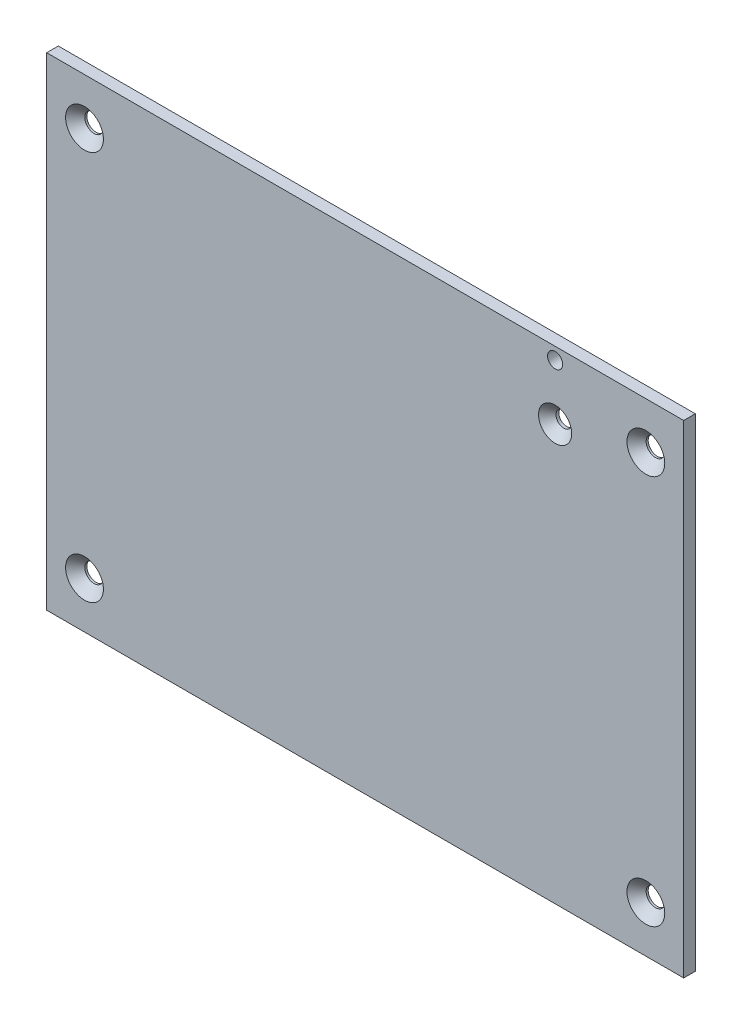
ISO-10303-21;
HEADER;
FILE_DESCRIPTION(('STEP AP214'),'2;1');
FILE_NAME('part.step','',(''),(''),'','','');
FILE_SCHEMA(('AUTOMOTIVE_DESIGN { 1 0 10303 214 1 1 1 1 }'));
ENDSEC;
DATA;
#1=APPLICATION_CONTEXT('core data for automotive mechanical design processes');
#2=APPLICATION_PROTOCOL_DEFINITION('international standard','automotive_design',2000,#1);
#3=PRODUCT_CONTEXT('',#1,'mechanical');
#4=PRODUCT('Part','Part','',(#3));
#5=PRODUCT_RELATED_PRODUCT_CATEGORY('part','',(#4));
#6=PRODUCT_DEFINITION_FORMATION('','',#4);
#7=PRODUCT_DEFINITION_CONTEXT('part definition',#1,'design');
#8=PRODUCT_DEFINITION('design','',#6,#7);
#9=PRODUCT_DEFINITION_SHAPE('','',#8);
#10=(LENGTH_UNIT() NAMED_UNIT(*) SI_UNIT(.MILLI.,.METRE.));
#11=(NAMED_UNIT(*) PLANE_ANGLE_UNIT() SI_UNIT($,.RADIAN.));
#12=(NAMED_UNIT(*) SI_UNIT($,.STERADIAN.) SOLID_ANGLE_UNIT());
#13=UNCERTAINTY_MEASURE_WITH_UNIT(LENGTH_MEASURE(1.E-05),#10,'distance_accuracy_value','');
#14=(GEOMETRIC_REPRESENTATION_CONTEXT(3) GLOBAL_UNCERTAINTY_ASSIGNED_CONTEXT((#13)) GLOBAL_UNIT_ASSIGNED_CONTEXT((#10,
#11,#12)) REPRESENTATION_CONTEXT('',''));
#15=CARTESIAN_POINT('',(0.,0.,0.));
#16=DIRECTION('',(0.,0.,1.));
#17=DIRECTION('',(1.,0.,0.));
#18=AXIS2_PLACEMENT_3D('',#15,#16,#17);
#19=CARTESIAN_POINT('',(-54.75,0.,2.));
#20=DIRECTION('',(1.,0.,0.));
#21=DIRECTION('',(0.,0.,-1.));
#22=AXIS2_PLACEMENT_3D('',#19,#20,#21);
#23=PLANE('',#22);
#24=DIRECTION('',(0.,-1.,0.));
#25=VECTOR('',#24,1.);
#26=CARTESIAN_POINT('',(-54.75,0.,0.));
#27=LINE('',#26,#25);
#28=CARTESIAN_POINT('',(-54.75,0.,0.));
#29=VERTEX_POINT('',#28);
#30=CARTESIAN_POINT('',(-54.75,-83.,0.));
#31=VERTEX_POINT('',#30);
#32=EDGE_CURVE('E96',#29,#31,#27,.T.);
#33=ORIENTED_EDGE('',*,*,#32,.T.);
#34=DIRECTION('',(0.,0.,-1.));
#35=VECTOR('',#34,1.);
#36=CARTESIAN_POINT('',(-54.75,-83.,2.));
#37=LINE('',#36,#35);
#38=CARTESIAN_POINT('',(-54.75,-83.,2.));
#39=VERTEX_POINT('',#38);
#40=EDGE_CURVE('E11',#39,#31,#37,.T.);
#41=ORIENTED_EDGE('',*,*,#40,.F.);
#42=DIRECTION('',(0.,-1.,0.));
#43=VECTOR('',#42,1.);
#44=CARTESIAN_POINT('',(-54.75,0.,2.));
#45=LINE('',#44,#43);
#46=CARTESIAN_POINT('',(-54.75,0.,2.));
#47=VERTEX_POINT('',#46);
#48=EDGE_CURVE('E84',#47,#39,#45,.T.);
#49=ORIENTED_EDGE('',*,*,#48,.F.);
#50=DIRECTION('',(0.,0.,-1.));
#51=VECTOR('',#50,1.);
#52=CARTESIAN_POINT('',(-54.75,0.,2.));
#53=LINE('',#52,#51);
#54=EDGE_CURVE('E92',#47,#29,#53,.T.);
#55=ORIENTED_EDGE('',*,*,#54,.T.);
#56=EDGE_LOOP('',(#33,#41,#49,#55));
#57=FACE_BOUND('',#56,.T.);
#58=ADVANCED_FACE('F33',(#57),#23,.F.);
#59=CARTESIAN_POINT('',(-54.75,-83.,2.));
#60=DIRECTION('',(0.,1.,0.));
#61=DIRECTION('',(0.,0.,1.));
#62=AXIS2_PLACEMENT_3D('',#59,#60,#61);
#63=PLANE('',#62);
#64=DIRECTION('',(1.,0.,0.));
#65=VECTOR('',#64,1.);
#66=CARTESIAN_POINT('',(-54.75,-83.,0.));
#67=LINE('',#66,#65);
#68=CARTESIAN_POINT('',(54.75,-83.,0.));
#69=VERTEX_POINT('',#68);
#70=EDGE_CURVE('E88',#31,#69,#67,.T.);
#71=ORIENTED_EDGE('',*,*,#70,.T.);
#72=DIRECTION('',(0.,0.,-1.));
#73=VECTOR('',#72,1.);
#74=CARTESIAN_POINT('',(54.75,-83.,2.));
#75=LINE('',#74,#73);
#76=CARTESIAN_POINT('',(54.75,-83.,2.));
#77=VERTEX_POINT('',#76);
#78=EDGE_CURVE('E41',#77,#69,#75,.T.);
#79=ORIENTED_EDGE('',*,*,#78,.F.);
#80=DIRECTION('',(1.,0.,0.));
#81=VECTOR('',#80,1.);
#82=CARTESIAN_POINT('',(-54.75,-83.,2.));
#83=LINE('',#82,#81);
#84=EDGE_CURVE('E79',#39,#77,#83,.T.);
#85=ORIENTED_EDGE('',*,*,#84,.F.);
#86=ORIENTED_EDGE('',*,*,#40,.T.);
#87=EDGE_LOOP('',(#71,#79,#85,#86));
#88=FACE_BOUND('',#87,.T.);
#89=ADVANCED_FACE('F87',(#88),#63,.F.);
#90=CARTESIAN_POINT('',(54.75,0.,2.));
#91=DIRECTION('',(-1.,0.,0.));
#92=DIRECTION('',(0.,-1.,0.));
#93=AXIS2_PLACEMENT_3D('',#90,#91,#92);
#94=PLANE('',#93);
#95=DIRECTION('',(0.,1.,0.));
#96=VECTOR('',#95,1.);
#97=CARTESIAN_POINT('',(54.75,0.,0.));
#98=LINE('',#97,#96);
#99=CARTESIAN_POINT('',(54.75,0.,0.));
#100=VERTEX_POINT('',#99);
#101=EDGE_CURVE('E66',#69,#100,#98,.T.);
#102=ORIENTED_EDGE('',*,*,#101,.T.);
#103=DIRECTION('',(0.,0.,-1.));
#104=VECTOR('',#103,1.);
#105=CARTESIAN_POINT('',(54.75,0.,2.));
#106=LINE('',#105,#104);
#107=CARTESIAN_POINT('',(54.75,0.,2.));
#108=VERTEX_POINT('',#107);
#109=EDGE_CURVE('E89',#108,#100,#106,.T.);
#110=ORIENTED_EDGE('',*,*,#109,.F.);
#111=DIRECTION('',(0.,1.,0.));
#112=VECTOR('',#111,1.);
#113=CARTESIAN_POINT('',(54.75,0.,2.));
#114=LINE('',#113,#112);
#115=EDGE_CURVE('E82',#77,#108,#114,.T.);
#116=ORIENTED_EDGE('',*,*,#115,.F.);
#117=ORIENTED_EDGE('',*,*,#78,.T.);
#118=EDGE_LOOP('',(#102,#110,#116,#117));
#119=FACE_BOUND('',#118,.T.);
#120=ADVANCED_FACE('F90',(#119),#94,.F.);
#121=CARTESIAN_POINT('',(-54.75,0.,2.));
#122=DIRECTION('',(0.,-1.,0.));
#123=DIRECTION('',(0.,0.,-1.));
#124=AXIS2_PLACEMENT_3D('',#121,#122,#123);
#125=PLANE('',#124);
#126=DIRECTION('',(-1.,0.,0.));
#127=VECTOR('',#126,1.);
#128=CARTESIAN_POINT('',(-54.75,0.,0.));
#129=LINE('',#128,#127);
#130=EDGE_CURVE('E72',#100,#29,#129,.T.);
#131=ORIENTED_EDGE('',*,*,#130,.T.);
#132=ORIENTED_EDGE('',*,*,#54,.F.);
#133=DIRECTION('',(-1.,0.,0.));
#134=VECTOR('',#133,1.);
#135=CARTESIAN_POINT('',(-54.75,0.,2.));
#136=LINE('',#135,#134);
#137=EDGE_CURVE('E49',#108,#47,#136,.T.);
#138=ORIENTED_EDGE('',*,*,#137,.F.);
#139=ORIENTED_EDGE('',*,*,#109,.T.);
#140=EDGE_LOOP('',(#131,#132,#138,#139));
#141=FACE_BOUND('',#140,.T.);
#142=ADVANCED_FACE('F104',(#141),#125,.F.);
#143=CARTESIAN_POINT('',(-54.75,-83.,2.));
#144=DIRECTION('',(0.,0.,1.));
#145=DIRECTION('',(1.,0.,0.));
#146=AXIS2_PLACEMENT_3D('',#143,#144,#145);
#147=PLANE('',#146);
#148=CARTESIAN_POINT('',(32.65,-2.07,2.));
#149=DIRECTION('',(0.,0.,1.));
#150=DIRECTION('',(1.,0.,0.));
#151=AXIS2_PLACEMENT_3D('',#148,#149,#150);
#152=CIRCLE('',#151,1.29999999999999);
#153=CARTESIAN_POINT('',(33.95,-2.07,2.));
#154=VERTEX_POINT('',#153);
#155=EDGE_CURVE('E157',#154,#154,#152,.T.);
#156=ORIENTED_EDGE('',*,*,#155,.F.);
#157=EDGE_LOOP('',(#156));
#158=FACE_BOUND('',#157,.T.);
#159=CARTESIAN_POINT('',(32.65,-11.6,2.));
#160=DIRECTION('',(0.,0.,1.));
#161=DIRECTION('',(1.,0.,0.));
#162=AXIS2_PLACEMENT_3D('',#159,#160,#161);
#163=CIRCLE('',#162,2.85);
#164=CARTESIAN_POINT('',(35.5,-11.6,2.));
#165=VERTEX_POINT('',#164);
#166=EDGE_CURVE('E151',#165,#165,#163,.T.);
#167=ORIENTED_EDGE('',*,*,#166,.F.);
#168=EDGE_LOOP('',(#167));
#169=FACE_BOUND('',#168,.T.);
#170=CARTESIAN_POINT('',(-48.25,-8.,2.));
#171=DIRECTION('',(0.,0.,1.));
#172=DIRECTION('',(1.,0.,0.));
#173=AXIS2_PLACEMENT_3D('',#170,#171,#172);
#174=CIRCLE('',#173,3.25);
#175=CARTESIAN_POINT('',(-45.,-8.,2.));
#176=VERTEX_POINT('',#175);
#177=EDGE_CURVE('E142',#176,#176,#174,.T.);
#178=ORIENTED_EDGE('',*,*,#177,.F.);
#179=EDGE_LOOP('',(#178));
#180=FACE_BOUND('',#179,.T.);
#181=CARTESIAN_POINT('',(-48.25,-75.,2.));
#182=DIRECTION('',(0.,0.,1.));
#183=DIRECTION('',(1.,0.,0.));
#184=AXIS2_PLACEMENT_3D('',#181,#182,#183);
#185=CIRCLE('',#184,3.25);
#186=CARTESIAN_POINT('',(-45.,-75.,2.));
#187=VERTEX_POINT('',#186);
#188=EDGE_CURVE('E133',#187,#187,#185,.T.);
#189=ORIENTED_EDGE('',*,*,#188,.F.);
#190=EDGE_LOOP('',(#189));
#191=FACE_BOUND('',#190,.T.);
#192=CARTESIAN_POINT('',(48.25,-75.,2.));
#193=DIRECTION('',(0.,0.,1.));
#194=DIRECTION('',(1.,0.,0.));
#195=AXIS2_PLACEMENT_3D('',#192,#193,#194);
#196=CIRCLE('',#195,3.25);
#197=CARTESIAN_POINT('',(51.5,-75.,2.));
#198=VERTEX_POINT('',#197);
#199=EDGE_CURVE('E124',#198,#198,#196,.T.);
#200=ORIENTED_EDGE('',*,*,#199,.F.);
#201=EDGE_LOOP('',(#200));
#202=FACE_BOUND('',#201,.T.);
#203=CARTESIAN_POINT('',(48.25,-8.,2.));
#204=DIRECTION('',(0.,0.,1.));
#205=DIRECTION('',(1.,0.,0.));
#206=AXIS2_PLACEMENT_3D('',#203,#204,#205);
#207=CIRCLE('',#206,3.25);
#208=CARTESIAN_POINT('',(51.5,-8.,2.));
#209=VERTEX_POINT('',#208);
#210=EDGE_CURVE('E115',#209,#209,#207,.T.);
#211=ORIENTED_EDGE('',*,*,#210,.F.);
#212=EDGE_LOOP('',(#211));
#213=FACE_BOUND('',#212,.T.);
#214=ORIENTED_EDGE('',*,*,#48,.T.);
#215=ORIENTED_EDGE('',*,*,#84,.T.);
#216=ORIENTED_EDGE('',*,*,#115,.T.);
#217=ORIENTED_EDGE('',*,*,#137,.T.);
#218=EDGE_LOOP('',(#214,#215,#216,#217));
#219=FACE_BOUND('',#218,.T.);
#220=ADVANCED_FACE('F80',(#158,#169,#180,#191,#202,#213,#219),#147,.T.);
#221=CARTESIAN_POINT('',(-54.75,-83.,0.));
#222=DIRECTION('',(0.,0.,1.));
#223=DIRECTION('',(1.,0.,0.));
#224=AXIS2_PLACEMENT_3D('',#221,#222,#223);
#225=PLANE('',#224);
#226=CARTESIAN_POINT('',(32.65,-2.07,0.));
#227=DIRECTION('',(0.,0.,1.));
#228=DIRECTION('',(1.,0.,0.));
#229=AXIS2_PLACEMENT_3D('',#226,#227,#228);
#230=CIRCLE('',#229,1.3);
#231=CARTESIAN_POINT('',(33.95,-2.07,0.));
#232=VERTEX_POINT('',#231);
#233=EDGE_CURVE('E154',#232,#232,#230,.T.);
#234=ORIENTED_EDGE('',*,*,#233,.T.);
#235=EDGE_LOOP('',(#234));
#236=FACE_BOUND('',#235,.T.);
#237=CARTESIAN_POINT('',(32.65,-11.6,0.));
#238=DIRECTION('',(0.,0.,1.));
#239=DIRECTION('',(1.,0.,0.));
#240=AXIS2_PLACEMENT_3D('',#237,#238,#239);
#241=CIRCLE('',#240,1.35);
#242=CARTESIAN_POINT('',(34.,-11.6,0.));
#243=VERTEX_POINT('',#242);
#244=EDGE_CURVE('E145',#243,#243,#241,.T.);
#245=ORIENTED_EDGE('',*,*,#244,.T.);
#246=EDGE_LOOP('',(#245));
#247=FACE_BOUND('',#246,.T.);
#248=CARTESIAN_POINT('',(-48.25,-8.,0.));
#249=DIRECTION('',(0.,0.,1.));
#250=DIRECTION('',(1.,0.,0.));
#251=AXIS2_PLACEMENT_3D('',#248,#249,#250);
#252=CIRCLE('',#251,1.6);
#253=CARTESIAN_POINT('',(-46.65,-8.,0.));
#254=VERTEX_POINT('',#253);
#255=EDGE_CURVE('E136',#254,#254,#252,.T.);
#256=ORIENTED_EDGE('',*,*,#255,.T.);
#257=EDGE_LOOP('',(#256));
#258=FACE_BOUND('',#257,.T.);
#259=CARTESIAN_POINT('',(-48.25,-75.,0.));
#260=DIRECTION('',(0.,0.,1.));
#261=DIRECTION('',(1.,0.,0.));
#262=AXIS2_PLACEMENT_3D('',#259,#260,#261);
#263=CIRCLE('',#262,1.6);
#264=CARTESIAN_POINT('',(-46.65,-75.,0.));
#265=VERTEX_POINT('',#264);
#266=EDGE_CURVE('E127',#265,#265,#263,.T.);
#267=ORIENTED_EDGE('',*,*,#266,.T.);
#268=EDGE_LOOP('',(#267));
#269=FACE_BOUND('',#268,.T.);
#270=CARTESIAN_POINT('',(48.25,-75.,0.));
#271=DIRECTION('',(0.,0.,1.));
#272=DIRECTION('',(1.,0.,0.));
#273=AXIS2_PLACEMENT_3D('',#270,#271,#272);
#274=CIRCLE('',#273,1.6);
#275=CARTESIAN_POINT('',(49.85,-75.,0.));
#276=VERTEX_POINT('',#275);
#277=EDGE_CURVE('E118',#276,#276,#274,.T.);
#278=ORIENTED_EDGE('',*,*,#277,.T.);
#279=EDGE_LOOP('',(#278));
#280=FACE_BOUND('',#279,.T.);
#281=CARTESIAN_POINT('',(48.25,-8.,0.));
#282=DIRECTION('',(0.,0.,1.));
#283=DIRECTION('',(1.,0.,0.));
#284=AXIS2_PLACEMENT_3D('',#281,#282,#283);
#285=CIRCLE('',#284,1.6);
#286=CARTESIAN_POINT('',(49.85,-8.,0.));
#287=VERTEX_POINT('',#286);
#288=EDGE_CURVE('E99',#287,#287,#285,.T.);
#289=ORIENTED_EDGE('',*,*,#288,.T.);
#290=EDGE_LOOP('',(#289));
#291=FACE_BOUND('',#290,.T.);
#292=ORIENTED_EDGE('',*,*,#32,.F.);
#293=ORIENTED_EDGE('',*,*,#130,.F.);
#294=ORIENTED_EDGE('',*,*,#101,.F.);
#295=ORIENTED_EDGE('',*,*,#70,.F.);
#296=EDGE_LOOP('',(#292,#293,#294,#295));
#297=FACE_BOUND('',#296,.T.);
#298=ADVANCED_FACE('F107',(#236,#247,#258,#269,#280,#291,#297),#225,.F.);
#299=CARTESIAN_POINT('',(48.25,-8.,2.));
#300=DIRECTION('',(0.,0.,1.));
#301=DIRECTION('',(1.,0.,0.));
#302=AXIS2_PLACEMENT_3D('',#299,#300,#301);
#303=CYLINDRICAL_SURFACE('',#302,1.6);
#304=ORIENTED_EDGE('',*,*,#288,.F.);
#305=EDGE_LOOP('',(#304));
#306=FACE_BOUND('',#305,.T.);
#307=CARTESIAN_POINT('',(48.25,-8.,0.350000000000001));
#308=DIRECTION('',(0.,0.,1.));
#309=DIRECTION('',(1.,0.,0.));
#310=AXIS2_PLACEMENT_3D('',#307,#308,#309);
#311=CIRCLE('',#310,1.6);
#312=CARTESIAN_POINT('',(49.85,-8.,0.350000000000001));
#313=VERTEX_POINT('',#312);
#314=EDGE_CURVE('E112',#313,#313,#311,.T.);
#315=ORIENTED_EDGE('',*,*,#314,.T.);
#316=EDGE_LOOP('',(#315));
#317=FACE_BOUND('',#316,.T.);
#318=ADVANCED_FACE('F179',(#306,#317),#303,.F.);
#319=CARTESIAN_POINT('',(48.25,-8.,2.));
#320=DIRECTION('',(0.,0.,1.));
#321=DIRECTION('',(1.,0.,0.));
#322=AXIS2_PLACEMENT_3D('',#319,#320,#321);
#323=CONICAL_SURFACE('',#322,3.25,0.78539816339745);
#324=ORIENTED_EDGE('',*,*,#314,.F.);
#325=EDGE_LOOP('',(#324));
#326=FACE_BOUND('',#325,.T.);
#327=ORIENTED_EDGE('',*,*,#210,.T.);
#328=EDGE_LOOP('',(#327));
#329=FACE_BOUND('',#328,.T.);
#330=ADVANCED_FACE('F176',(#326,#329),#323,.F.);
#331=CARTESIAN_POINT('',(48.25,-75.,2.));
#332=DIRECTION('',(0.,0.,1.));
#333=DIRECTION('',(1.,0.,0.));
#334=AXIS2_PLACEMENT_3D('',#331,#332,#333);
#335=CYLINDRICAL_SURFACE('',#334,1.6);
#336=ORIENTED_EDGE('',*,*,#277,.F.);
#337=EDGE_LOOP('',(#336));
#338=FACE_BOUND('',#337,.T.);
#339=CARTESIAN_POINT('',(48.25,-75.,0.350000000000001));
#340=DIRECTION('',(0.,0.,1.));
#341=DIRECTION('',(1.,0.,0.));
#342=AXIS2_PLACEMENT_3D('',#339,#340,#341);
#343=CIRCLE('',#342,1.6);
#344=CARTESIAN_POINT('',(49.85,-75.,0.350000000000001));
#345=VERTEX_POINT('',#344);
#346=EDGE_CURVE('E121',#345,#345,#343,.T.);
#347=ORIENTED_EDGE('',*,*,#346,.T.);
#348=EDGE_LOOP('',(#347));
#349=FACE_BOUND('',#348,.T.);
#350=ADVANCED_FACE('F178',(#338,#349),#335,.F.);
#351=CARTESIAN_POINT('',(48.25,-75.,2.));
#352=DIRECTION('',(0.,0.,1.));
#353=DIRECTION('',(1.,0.,0.));
#354=AXIS2_PLACEMENT_3D('',#351,#352,#353);
#355=CONICAL_SURFACE('',#354,3.25,0.78539816339745);
#356=ORIENTED_EDGE('',*,*,#346,.F.);
#357=EDGE_LOOP('',(#356));
#358=FACE_BOUND('',#357,.T.);
#359=ORIENTED_EDGE('',*,*,#199,.T.);
#360=EDGE_LOOP('',(#359));
#361=FACE_BOUND('',#360,.T.);
#362=ADVANCED_FACE('F186',(#358,#361),#355,.F.);
#363=CARTESIAN_POINT('',(-48.25,-75.,2.));
#364=DIRECTION('',(0.,0.,1.));
#365=DIRECTION('',(1.,0.,0.));
#366=AXIS2_PLACEMENT_3D('',#363,#364,#365);
#367=CYLINDRICAL_SURFACE('',#366,1.6);
#368=ORIENTED_EDGE('',*,*,#266,.F.);
#369=EDGE_LOOP('',(#368));
#370=FACE_BOUND('',#369,.T.);
#371=CARTESIAN_POINT('',(-48.25,-75.,0.350000000000001));
#372=DIRECTION('',(0.,0.,1.));
#373=DIRECTION('',(1.,0.,0.));
#374=AXIS2_PLACEMENT_3D('',#371,#372,#373);
#375=CIRCLE('',#374,1.6);
#376=CARTESIAN_POINT('',(-46.65,-75.,0.350000000000001));
#377=VERTEX_POINT('',#376);
#378=EDGE_CURVE('E130',#377,#377,#375,.T.);
#379=ORIENTED_EDGE('',*,*,#378,.T.);
#380=EDGE_LOOP('',(#379));
#381=FACE_BOUND('',#380,.T.);
#382=ADVANCED_FACE('F224',(#370,#381),#367,.F.);
#383=CARTESIAN_POINT('',(-48.25,-75.,2.));
#384=DIRECTION('',(0.,0.,1.));
#385=DIRECTION('',(1.,0.,0.));
#386=AXIS2_PLACEMENT_3D('',#383,#384,#385);
#387=CONICAL_SURFACE('',#386,3.25,0.78539816339745);
#388=ORIENTED_EDGE('',*,*,#378,.F.);
#389=EDGE_LOOP('',(#388));
#390=FACE_BOUND('',#389,.T.);
#391=ORIENTED_EDGE('',*,*,#188,.T.);
#392=EDGE_LOOP('',(#391));
#393=FACE_BOUND('',#392,.T.);
#394=ADVANCED_FACE('F229',(#390,#393),#387,.F.);
#395=CARTESIAN_POINT('',(-48.25,-8.,2.));
#396=DIRECTION('',(0.,0.,1.));
#397=DIRECTION('',(1.,0.,0.));
#398=AXIS2_PLACEMENT_3D('',#395,#396,#397);
#399=CYLINDRICAL_SURFACE('',#398,1.6);
#400=ORIENTED_EDGE('',*,*,#255,.F.);
#401=EDGE_LOOP('',(#400));
#402=FACE_BOUND('',#401,.T.);
#403=CARTESIAN_POINT('',(-48.25,-8.,0.350000000000001));
#404=DIRECTION('',(0.,0.,1.));
#405=DIRECTION('',(1.,0.,0.));
#406=AXIS2_PLACEMENT_3D('',#403,#404,#405);
#407=CIRCLE('',#406,1.6);
#408=CARTESIAN_POINT('',(-46.65,-8.,0.350000000000001));
#409=VERTEX_POINT('',#408);
#410=EDGE_CURVE('E139',#409,#409,#407,.T.);
#411=ORIENTED_EDGE('',*,*,#410,.T.);
#412=EDGE_LOOP('',(#411));
#413=FACE_BOUND('',#412,.T.);
#414=ADVANCED_FACE('F235',(#402,#413),#399,.F.);
#415=CARTESIAN_POINT('',(-48.25,-8.,2.));
#416=DIRECTION('',(0.,0.,1.));
#417=DIRECTION('',(1.,0.,0.));
#418=AXIS2_PLACEMENT_3D('',#415,#416,#417);
#419=CONICAL_SURFACE('',#418,3.25,0.78539816339745);
#420=ORIENTED_EDGE('',*,*,#410,.F.);
#421=EDGE_LOOP('',(#420));
#422=FACE_BOUND('',#421,.T.);
#423=ORIENTED_EDGE('',*,*,#177,.T.);
#424=EDGE_LOOP('',(#423));
#425=FACE_BOUND('',#424,.T.);
#426=ADVANCED_FACE('F239',(#422,#425),#419,.F.);
#427=CARTESIAN_POINT('',(32.65,-11.6,2.));
#428=DIRECTION('',(0.,0.,1.));
#429=DIRECTION('',(1.,0.,0.));
#430=AXIS2_PLACEMENT_3D('',#427,#428,#429);
#431=CYLINDRICAL_SURFACE('',#430,1.35);
#432=ORIENTED_EDGE('',*,*,#244,.F.);
#433=EDGE_LOOP('',(#432));
#434=FACE_BOUND('',#433,.T.);
#435=CARTESIAN_POINT('',(32.65,-11.6,0.500000000000001));
#436=DIRECTION('',(0.,0.,1.));
#437=DIRECTION('',(1.,0.,0.));
#438=AXIS2_PLACEMENT_3D('',#435,#436,#437);
#439=CIRCLE('',#438,1.35);
#440=CARTESIAN_POINT('',(34.,-11.6,0.500000000000001));
#441=VERTEX_POINT('',#440);
#442=EDGE_CURVE('E148',#441,#441,#439,.T.);
#443=ORIENTED_EDGE('',*,*,#442,.T.);
#444=EDGE_LOOP('',(#443));
#445=FACE_BOUND('',#444,.T.);
#446=ADVANCED_FACE('F243',(#434,#445),#431,.F.);
#447=CARTESIAN_POINT('',(32.65,-11.6,2.));
#448=DIRECTION('',(0.,0.,1.));
#449=DIRECTION('',(1.,0.,0.));
#450=AXIS2_PLACEMENT_3D('',#447,#448,#449);
#451=CONICAL_SURFACE('',#450,2.85,0.785398163397449);
#452=ORIENTED_EDGE('',*,*,#442,.F.);
#453=EDGE_LOOP('',(#452));
#454=FACE_BOUND('',#453,.T.);
#455=ORIENTED_EDGE('',*,*,#166,.T.);
#456=EDGE_LOOP('',(#455));
#457=FACE_BOUND('',#456,.T.);
#458=ADVANCED_FACE('F247',(#454,#457),#451,.F.);
#459=CARTESIAN_POINT('',(32.65,-2.07,2.));
#460=DIRECTION('',(0.,0.,1.));
#461=DIRECTION('',(1.,0.,0.));
#462=AXIS2_PLACEMENT_3D('',#459,#460,#461);
#463=CYLINDRICAL_SURFACE('',#462,1.3);
#464=ORIENTED_EDGE('',*,*,#233,.F.);
#465=EDGE_LOOP('',(#464));
#466=FACE_BOUND('',#465,.T.);
#467=ORIENTED_EDGE('',*,*,#155,.T.);
#468=EDGE_LOOP('',(#467));
#469=FACE_BOUND('',#468,.T.);
#470=ADVANCED_FACE('F161',(#466,#469),#463,.F.);
#471=CLOSED_SHELL('',(#58,#89,#120,#142,#220,#298,#318,#330,#350,#362,#382,#394,#414,#426,#446,
#458,#470));
#472=MANIFOLD_SOLID_BREP('B2',#471);
#473=ADVANCED_BREP_SHAPE_REPRESENTATION('',(#18,#472),#14);
#474=SHAPE_DEFINITION_REPRESENTATION(#9,#473);
ENDSEC;
END-ISO-10303-21;
